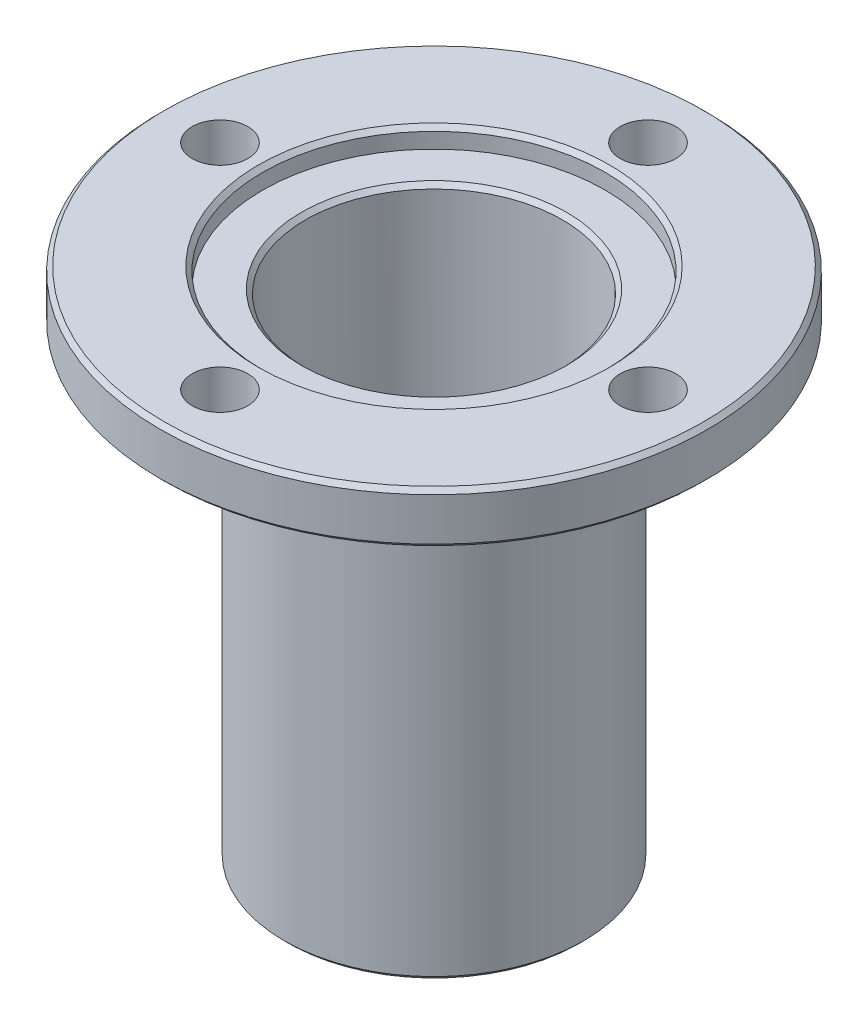
ISO-10303-21;
HEADER;
FILE_DESCRIPTION(('STEP AP214'),'2;1');
FILE_NAME('part.step','',(''),(''),'','','');
FILE_SCHEMA(('AUTOMOTIVE_DESIGN { 1 0 10303 214 1 1 1 1 }'));
ENDSEC;
DATA;
#1=APPLICATION_CONTEXT('core data for automotive mechanical design processes');
#2=APPLICATION_PROTOCOL_DEFINITION('international standard','automotive_design',2000,#1);
#3=PRODUCT_CONTEXT('',#1,'mechanical');
#4=PRODUCT('Part','Part','',(#3));
#5=PRODUCT_RELATED_PRODUCT_CATEGORY('part','',(#4));
#6=PRODUCT_DEFINITION_FORMATION('','',#4);
#7=PRODUCT_DEFINITION_CONTEXT('part definition',#1,'design');
#8=PRODUCT_DEFINITION('design','',#6,#7);
#9=PRODUCT_DEFINITION_SHAPE('','',#8);
#10=(LENGTH_UNIT() NAMED_UNIT(*) SI_UNIT(.MILLI.,.METRE.));
#11=(NAMED_UNIT(*) PLANE_ANGLE_UNIT() SI_UNIT($,.RADIAN.));
#12=(NAMED_UNIT(*) SI_UNIT($,.STERADIAN.) SOLID_ANGLE_UNIT());
#13=UNCERTAINTY_MEASURE_WITH_UNIT(LENGTH_MEASURE(1.E-05),#10,'distance_accuracy_value','');
#14=(GEOMETRIC_REPRESENTATION_CONTEXT(3) GLOBAL_UNCERTAINTY_ASSIGNED_CONTEXT((#13)) GLOBAL_UNIT_ASSIGNED_CONTEXT((#10,
#11,#12)) REPRESENTATION_CONTEXT('',''));
#15=CARTESIAN_POINT('',(0.,0.,0.));
#16=DIRECTION('',(0.,0.,1.));
#17=DIRECTION('',(1.,0.,0.));
#18=AXIS2_PLACEMENT_3D('',#15,#16,#17);
#19=CARTESIAN_POINT('',(0.,6.,0.));
#20=DIRECTION('',(0.,-1.,0.));
#21=DIRECTION('',(0.,0.,-1.));
#22=AXIS2_PLACEMENT_3D('',#19,#20,#21);
#23=CYLINDRICAL_SURFACE('',#22,32.);
#24=CARTESIAN_POINT('',(0.,0.499999999999994,0.));
#25=DIRECTION('',(0.,1.,0.));
#26=DIRECTION('',(0.,0.,1.));
#27=AXIS2_PLACEMENT_3D('',#24,#25,#26);
#28=CIRCLE('',#27,32.);
#29=CARTESIAN_POINT('',(0.,0.499999999999994,32.));
#30=VERTEX_POINT('',#29);
#31=EDGE_CURVE('E41',#30,#30,#28,.T.);
#32=ORIENTED_EDGE('',*,*,#31,.T.);
#33=EDGE_LOOP('',(#32));
#34=FACE_BOUND('',#33,.T.);
#35=CARTESIAN_POINT('',(0.,5.50000000000001,0.));
#36=DIRECTION('',(0.,1.,0.));
#37=DIRECTION('',(0.,0.,1.));
#38=AXIS2_PLACEMENT_3D('',#35,#36,#37);
#39=CIRCLE('',#38,32.);
#40=CARTESIAN_POINT('',(0.,5.50000000000001,32.));
#41=VERTEX_POINT('',#40);
#42=EDGE_CURVE('E45',#41,#41,#39,.F.);
#43=ORIENTED_EDGE('',*,*,#42,.T.);
#44=EDGE_LOOP('',(#43));
#45=FACE_BOUND('',#44,.T.);
#46=ADVANCED_FACE('F33',(#34,#45),#23,.T.);
#47=CARTESIAN_POINT('',(0.,6.,0.));
#48=DIRECTION('',(0.,1.,0.));
#49=DIRECTION('',(0.,0.,1.));
#50=AXIS2_PLACEMENT_3D('',#47,#48,#49);
#51=PLANE('',#50);
#52=CARTESIAN_POINT('',(0.,6.,0.));
#53=DIRECTION('',(0.,1.,0.));
#54=DIRECTION('',(0.,0.,1.));
#55=AXIS2_PLACEMENT_3D('',#52,#53,#54);
#56=CIRCLE('',#55,20.5);
#57=CARTESIAN_POINT('',(0.,6.,20.5));
#58=VERTEX_POINT('',#57);
#59=EDGE_CURVE('E49',#58,#58,#56,.F.);
#60=ORIENTED_EDGE('',*,*,#59,.T.);
#61=EDGE_LOOP('',(#60));
#62=FACE_BOUND('',#61,.T.);
#63=CARTESIAN_POINT('',(0.,6.,0.));
#64=DIRECTION('',(0.,1.,0.));
#65=DIRECTION('',(0.,0.,1.));
#66=AXIS2_PLACEMENT_3D('',#63,#64,#65);
#67=CIRCLE('',#66,31.5);
#68=CARTESIAN_POINT('',(0.,6.,31.5));
#69=VERTEX_POINT('',#68);
#70=EDGE_CURVE('E54',#69,#69,#67,.T.);
#71=ORIENTED_EDGE('',*,*,#70,.T.);
#72=EDGE_LOOP('',(#71));
#73=FACE_BOUND('',#72,.T.);
#74=CARTESIAN_POINT('',(0.,6.,-25.));
#75=DIRECTION('',(0.,1.,0.));
#76=DIRECTION('',(0.,0.,1.));
#77=AXIS2_PLACEMENT_3D('',#74,#75,#76);
#78=CIRCLE('',#77,3.25);
#79=CARTESIAN_POINT('',(0.,6.,-21.75));
#80=VERTEX_POINT('',#79);
#81=EDGE_CURVE('E92',#80,#80,#78,.T.);
#82=ORIENTED_EDGE('',*,*,#81,.F.);
#83=EDGE_LOOP('',(#82));
#84=FACE_BOUND('',#83,.T.);
#85=CARTESIAN_POINT('',(25.,6.,0.));
#86=DIRECTION('',(0.,1.,0.));
#87=DIRECTION('',(0.,0.,1.));
#88=AXIS2_PLACEMENT_3D('',#85,#86,#87);
#89=CIRCLE('',#88,3.25);
#90=CARTESIAN_POINT('',(25.,6.,3.25));
#91=VERTEX_POINT('',#90);
#92=EDGE_CURVE('E103',#91,#91,#89,.T.);
#93=ORIENTED_EDGE('',*,*,#92,.F.);
#94=EDGE_LOOP('',(#93));
#95=FACE_BOUND('',#94,.T.);
#96=CARTESIAN_POINT('',(0.,6.,25.));
#97=DIRECTION('',(0.,1.,0.));
#98=DIRECTION('',(0.,0.,1.));
#99=AXIS2_PLACEMENT_3D('',#96,#97,#98);
#100=CIRCLE('',#99,3.25);
#101=CARTESIAN_POINT('',(0.,6.,28.25));
#102=VERTEX_POINT('',#101);
#103=EDGE_CURVE('E100',#102,#102,#100,.T.);
#104=ORIENTED_EDGE('',*,*,#103,.F.);
#105=EDGE_LOOP('',(#104));
#106=FACE_BOUND('',#105,.T.);
#107=CARTESIAN_POINT('',(-25.,6.,0.));
#108=DIRECTION('',(0.,1.,0.));
#109=DIRECTION('',(0.,0.,1.));
#110=AXIS2_PLACEMENT_3D('',#107,#108,#109);
#111=CIRCLE('',#110,3.25);
#112=CARTESIAN_POINT('',(-25.,6.,3.25));
#113=VERTEX_POINT('',#112);
#114=EDGE_CURVE('E97',#113,#113,#111,.T.);
#115=ORIENTED_EDGE('',*,*,#114,.F.);
#116=EDGE_LOOP('',(#115));
#117=FACE_BOUND('',#116,.T.);
#118=ADVANCED_FACE('F112',(#62,#73,#84,#95,#106,#117),#51,.T.);
#119=CARTESIAN_POINT('',(0.,0.,0.));
#120=DIRECTION('',(0.,1.,0.));
#121=DIRECTION('',(0.,0.,1.));
#122=AXIS2_PLACEMENT_3D('',#119,#120,#121);
#123=PLANE('',#122);
#124=CARTESIAN_POINT('',(0.,0.,0.));
#125=DIRECTION('',(0.,1.,0.));
#126=DIRECTION('',(0.,0.,1.));
#127=AXIS2_PLACEMENT_3D('',#124,#125,#126);
#128=CIRCLE('',#127,31.5);
#129=CARTESIAN_POINT('',(0.,0.,31.5));
#130=VERTEX_POINT('',#129);
#131=EDGE_CURVE('E10',#130,#130,#128,.F.);
#132=ORIENTED_EDGE('',*,*,#131,.T.);
#133=EDGE_LOOP('',(#132));
#134=FACE_BOUND('',#133,.T.);
#135=CARTESIAN_POINT('',(0.,0.,-25.));
#136=DIRECTION('',(0.,1.,0.));
#137=DIRECTION('',(0.,0.,1.));
#138=AXIS2_PLACEMENT_3D('',#135,#136,#137);
#139=CIRCLE('',#138,3.25);
#140=CARTESIAN_POINT('',(0.,0.,-21.75));
#141=VERTEX_POINT('',#140);
#142=EDGE_CURVE('E79',#141,#141,#139,.T.);
#143=ORIENTED_EDGE('',*,*,#142,.T.);
#144=EDGE_LOOP('',(#143));
#145=FACE_BOUND('',#144,.T.);
#146=CARTESIAN_POINT('',(25.,0.,0.));
#147=DIRECTION('',(0.,1.,0.));
#148=DIRECTION('',(0.,0.,1.));
#149=AXIS2_PLACEMENT_3D('',#146,#147,#148);
#150=CIRCLE('',#149,3.25);
#151=CARTESIAN_POINT('',(25.,0.,3.25));
#152=VERTEX_POINT('',#151);
#153=EDGE_CURVE('E83',#152,#152,#150,.T.);
#154=ORIENTED_EDGE('',*,*,#153,.T.);
#155=EDGE_LOOP('',(#154));
#156=FACE_BOUND('',#155,.T.);
#157=CARTESIAN_POINT('',(0.,0.,25.));
#158=DIRECTION('',(0.,1.,0.));
#159=DIRECTION('',(0.,0.,1.));
#160=AXIS2_PLACEMENT_3D('',#157,#158,#159);
#161=CIRCLE('',#160,3.25);
#162=CARTESIAN_POINT('',(0.,0.,28.25));
#163=VERTEX_POINT('',#162);
#164=EDGE_CURVE('E86',#163,#163,#161,.T.);
#165=ORIENTED_EDGE('',*,*,#164,.T.);
#166=EDGE_LOOP('',(#165));
#167=FACE_BOUND('',#166,.T.);
#168=CARTESIAN_POINT('',(-25.,0.,0.));
#169=DIRECTION('',(0.,1.,0.));
#170=DIRECTION('',(0.,0.,1.));
#171=AXIS2_PLACEMENT_3D('',#168,#169,#170);
#172=CIRCLE('',#171,3.25);
#173=CARTESIAN_POINT('',(-25.,0.,3.25));
#174=VERTEX_POINT('',#173);
#175=EDGE_CURVE('E89',#174,#174,#172,.T.);
#176=ORIENTED_EDGE('',*,*,#175,.T.);
#177=EDGE_LOOP('',(#176));
#178=FACE_BOUND('',#177,.T.);
#179=CARTESIAN_POINT('',(0.,0.,0.));
#180=DIRECTION('',(0.,-1.,0.));
#181=DIRECTION('',(0.,0.,-1.));
#182=AXIS2_PLACEMENT_3D('',#179,#180,#181);
#183=CIRCLE('',#182,17.5);
#184=CARTESIAN_POINT('',(0.,0.,-17.5));
#185=VERTEX_POINT('',#184);
#186=EDGE_CURVE('E78',#185,#185,#183,.T.);
#187=ORIENTED_EDGE('',*,*,#186,.F.);
#188=EDGE_LOOP('',(#187));
#189=FACE_BOUND('',#188,.T.);
#190=ADVANCED_FACE('F115',(#134,#145,#156,#167,#178,#189),#123,.F.);
#191=CARTESIAN_POINT('',(0.,-54.,0.));
#192=DIRECTION('',(0.,1.,0.));
#193=DIRECTION('',(0.,0.,1.));
#194=AXIS2_PLACEMENT_3D('',#191,#192,#193);
#195=CYLINDRICAL_SURFACE('',#194,17.5);
#196=CARTESIAN_POINT('',(0.,-53.5,0.));
#197=DIRECTION('',(0.,-1.,0.));
#198=DIRECTION('',(0.,0.,-1.));
#199=AXIS2_PLACEMENT_3D('',#196,#197,#198);
#200=CIRCLE('',#199,17.5);
#201=CARTESIAN_POINT('',(0.,-53.5,-17.5));
#202=VERTEX_POINT('',#201);
#203=EDGE_CURVE('E69',#202,#202,#200,.F.);
#204=ORIENTED_EDGE('',*,*,#203,.T.);
#205=EDGE_LOOP('',(#204));
#206=FACE_BOUND('',#205,.T.);
#207=ORIENTED_EDGE('',*,*,#186,.T.);
#208=EDGE_LOOP('',(#207));
#209=FACE_BOUND('',#208,.T.);
#210=ADVANCED_FACE('F134',(#206,#209),#195,.T.);
#211=CARTESIAN_POINT('',(0.,-54.,0.));
#212=DIRECTION('',(0.,-1.,0.));
#213=DIRECTION('',(0.,0.,-1.));
#214=AXIS2_PLACEMENT_3D('',#211,#212,#213);
#215=PLANE('',#214);
#216=CARTESIAN_POINT('',(0.,-54.,0.));
#217=DIRECTION('',(0.,-1.,0.));
#218=DIRECTION('',(0.,0.,-1.));
#219=AXIS2_PLACEMENT_3D('',#216,#217,#218);
#220=CIRCLE('',#219,17.);
#221=CARTESIAN_POINT('',(0.,-54.,-17.));
#222=VERTEX_POINT('',#221);
#223=EDGE_CURVE('E72',#222,#222,#220,.T.);
#224=ORIENTED_EDGE('',*,*,#223,.T.);
#225=EDGE_LOOP('',(#224));
#226=FACE_BOUND('',#225,.T.);
#227=CARTESIAN_POINT('',(0.,-54.,0.));
#228=DIRECTION('',(0.,-1.,0.));
#229=DIRECTION('',(0.,0.,-1.));
#230=AXIS2_PLACEMENT_3D('',#227,#228,#229);
#231=CIRCLE('',#230,15.5);
#232=CARTESIAN_POINT('',(0.,-54.,-15.5));
#233=VERTEX_POINT('',#232);
#234=EDGE_CURVE('E75',#233,#233,#231,.F.);
#235=ORIENTED_EDGE('',*,*,#234,.T.);
#236=EDGE_LOOP('',(#235));
#237=FACE_BOUND('',#236,.T.);
#238=ADVANCED_FACE('F139',(#226,#237),#215,.T.);
#239=CARTESIAN_POINT('',(0.,3.7,0.));
#240=DIRECTION('',(0.,1.,0.));
#241=DIRECTION('',(0.,0.,1.));
#242=AXIS2_PLACEMENT_3D('',#239,#240,#241);
#243=CYLINDRICAL_SURFACE('',#242,20.);
#244=CARTESIAN_POINT('',(0.,5.5,0.));
#245=DIRECTION('',(0.,1.,0.));
#246=DIRECTION('',(0.,0.,1.));
#247=AXIS2_PLACEMENT_3D('',#244,#245,#246);
#248=CIRCLE('',#247,20.);
#249=CARTESIAN_POINT('',(0.,5.5,20.));
#250=VERTEX_POINT('',#249);
#251=EDGE_CURVE('E57',#250,#250,#248,.T.);
#252=ORIENTED_EDGE('',*,*,#251,.T.);
#253=EDGE_LOOP('',(#252));
#254=FACE_BOUND('',#253,.T.);
#255=CARTESIAN_POINT('',(0.,3.7,0.));
#256=DIRECTION('',(0.,1.,0.));
#257=DIRECTION('',(0.,0.,1.));
#258=AXIS2_PLACEMENT_3D('',#255,#256,#257);
#259=CIRCLE('',#258,20.);
#260=CARTESIAN_POINT('',(0.,3.7,20.));
#261=VERTEX_POINT('',#260);
#262=EDGE_CURVE('E82',#261,#261,#259,.T.);
#263=ORIENTED_EDGE('',*,*,#262,.F.);
#264=EDGE_LOOP('',(#263));
#265=FACE_BOUND('',#264,.T.);
#266=ADVANCED_FACE('F145',(#254,#265),#243,.F.);
#267=CARTESIAN_POINT('',(0.,3.7,0.));
#268=DIRECTION('',(0.,1.,0.));
#269=DIRECTION('',(0.,0.,1.));
#270=AXIS2_PLACEMENT_3D('',#267,#268,#269);
#271=PLANE('',#270);
#272=CARTESIAN_POINT('',(0.,3.7,0.));
#273=DIRECTION('',(0.,1.,0.));
#274=DIRECTION('',(0.,0.,1.));
#275=AXIS2_PLACEMENT_3D('',#272,#273,#274);
#276=CIRCLE('',#275,15.5);
#277=CARTESIAN_POINT('',(0.,3.7,15.5));
#278=VERTEX_POINT('',#277);
#279=EDGE_CURVE('E60',#278,#278,#276,.F.);
#280=ORIENTED_EDGE('',*,*,#279,.T.);
#281=EDGE_LOOP('',(#280));
#282=FACE_BOUND('',#281,.T.);
#283=ORIENTED_EDGE('',*,*,#262,.T.);
#284=EDGE_LOOP('',(#283));
#285=FACE_BOUND('',#284,.T.);
#286=ADVANCED_FACE('F237',(#282,#285),#271,.T.);
#287=CARTESIAN_POINT('',(0.,-54.,0.));
#288=DIRECTION('',(0.,1.,0.));
#289=DIRECTION('',(0.,0.,1.));
#290=AXIS2_PLACEMENT_3D('',#287,#288,#289);
#291=CYLINDRICAL_SURFACE('',#290,15.);
#292=CARTESIAN_POINT('',(0.,-53.5,0.));
#293=DIRECTION('',(0.,-1.,0.));
#294=DIRECTION('',(0.,0.,-1.));
#295=AXIS2_PLACEMENT_3D('',#292,#293,#294);
#296=CIRCLE('',#295,15.);
#297=CARTESIAN_POINT('',(0.,-53.5,-15.));
#298=VERTEX_POINT('',#297);
#299=EDGE_CURVE('E63',#298,#298,#296,.T.);
#300=ORIENTED_EDGE('',*,*,#299,.T.);
#301=EDGE_LOOP('',(#300));
#302=FACE_BOUND('',#301,.T.);
#303=CARTESIAN_POINT('',(0.,3.20000000000002,0.));
#304=DIRECTION('',(0.,1.,0.));
#305=DIRECTION('',(0.,0.,1.));
#306=AXIS2_PLACEMENT_3D('',#303,#304,#305);
#307=CIRCLE('',#306,15.);
#308=CARTESIAN_POINT('',(0.,3.20000000000002,15.));
#309=VERTEX_POINT('',#308);
#310=EDGE_CURVE('E66',#309,#309,#307,.T.);
#311=ORIENTED_EDGE('',*,*,#310,.T.);
#312=EDGE_LOOP('',(#311));
#313=FACE_BOUND('',#312,.T.);
#314=ADVANCED_FACE('F128',(#302,#313),#291,.F.);
#315=CARTESIAN_POINT('',(-25.,-54.,0.));
#316=DIRECTION('',(0.,1.,0.));
#317=DIRECTION('',(0.,0.,1.));
#318=AXIS2_PLACEMENT_3D('',#315,#316,#317);
#319=CYLINDRICAL_SURFACE('',#318,3.25);
#320=ORIENTED_EDGE('',*,*,#114,.T.);
#321=EDGE_LOOP('',(#320));
#322=FACE_BOUND('',#321,.T.);
#323=ORIENTED_EDGE('',*,*,#175,.F.);
#324=EDGE_LOOP('',(#323));
#325=FACE_BOUND('',#324,.T.);
#326=ADVANCED_FACE('F124',(#322,#325),#319,.F.);
#327=CARTESIAN_POINT('',(0.,-54.,25.));
#328=DIRECTION('',(0.,1.,0.));
#329=DIRECTION('',(0.,0.,1.));
#330=AXIS2_PLACEMENT_3D('',#327,#328,#329);
#331=CYLINDRICAL_SURFACE('',#330,3.25);
#332=ORIENTED_EDGE('',*,*,#103,.T.);
#333=EDGE_LOOP('',(#332));
#334=FACE_BOUND('',#333,.T.);
#335=ORIENTED_EDGE('',*,*,#164,.F.);
#336=EDGE_LOOP('',(#335));
#337=FACE_BOUND('',#336,.T.);
#338=ADVANCED_FACE('F127',(#334,#337),#331,.F.);
#339=CARTESIAN_POINT('',(25.,-54.,0.));
#340=DIRECTION('',(0.,1.,0.));
#341=DIRECTION('',(0.,0.,1.));
#342=AXIS2_PLACEMENT_3D('',#339,#340,#341);
#343=CYLINDRICAL_SURFACE('',#342,3.25);
#344=ORIENTED_EDGE('',*,*,#92,.T.);
#345=EDGE_LOOP('',(#344));
#346=FACE_BOUND('',#345,.T.);
#347=ORIENTED_EDGE('',*,*,#153,.F.);
#348=EDGE_LOOP('',(#347));
#349=FACE_BOUND('',#348,.T.);
#350=ADVANCED_FACE('F290',(#346,#349),#343,.F.);
#351=CARTESIAN_POINT('',(0.,-54.,-25.));
#352=DIRECTION('',(0.,1.,0.));
#353=DIRECTION('',(0.,0.,1.));
#354=AXIS2_PLACEMENT_3D('',#351,#352,#353);
#355=CYLINDRICAL_SURFACE('',#354,3.25);
#356=ORIENTED_EDGE('',*,*,#81,.T.);
#357=EDGE_LOOP('',(#356));
#358=FACE_BOUND('',#357,.T.);
#359=ORIENTED_EDGE('',*,*,#142,.F.);
#360=EDGE_LOOP('',(#359));
#361=FACE_BOUND('',#360,.T.);
#362=ADVANCED_FACE('F109',(#358,#361),#355,.F.);
#363=CARTESIAN_POINT('',(0.,-54.,0.));
#364=DIRECTION('',(0.,1.,0.));
#365=DIRECTION('',(0.,0.,1.));
#366=AXIS2_PLACEMENT_3D('',#363,#364,#365);
#367=CONICAL_SURFACE('',#366,17.,0.785398163397445);
#368=ORIENTED_EDGE('',*,*,#203,.F.);
#369=EDGE_LOOP('',(#368));
#370=FACE_BOUND('',#369,.T.);
#371=ORIENTED_EDGE('',*,*,#223,.F.);
#372=EDGE_LOOP('',(#371));
#373=FACE_BOUND('',#372,.T.);
#374=ADVANCED_FACE('F155',(#370,#373),#367,.T.);
#375=CARTESIAN_POINT('',(0.,-54.,0.));
#376=DIRECTION('',(0.,-1.,0.));
#377=DIRECTION('',(0.,0.,-1.));
#378=AXIS2_PLACEMENT_3D('',#375,#376,#377);
#379=CONICAL_SURFACE('',#378,15.5,0.785398163397453);
#380=ORIENTED_EDGE('',*,*,#299,.F.);
#381=EDGE_LOOP('',(#380));
#382=FACE_BOUND('',#381,.T.);
#383=ORIENTED_EDGE('',*,*,#234,.F.);
#384=EDGE_LOOP('',(#383));
#385=FACE_BOUND('',#384,.T.);
#386=ADVANCED_FACE('F161',(#382,#385),#379,.F.);
#387=CARTESIAN_POINT('',(0.,3.20000000000002,0.));
#388=DIRECTION('',(0.,1.,0.));
#389=DIRECTION('',(0.,0.,1.));
#390=AXIS2_PLACEMENT_3D('',#387,#388,#389);
#391=CONICAL_SURFACE('',#390,15.,0.78539816339745);
#392=ORIENTED_EDGE('',*,*,#279,.F.);
#393=EDGE_LOOP('',(#392));
#394=FACE_BOUND('',#393,.T.);
#395=ORIENTED_EDGE('',*,*,#310,.F.);
#396=EDGE_LOOP('',(#395));
#397=FACE_BOUND('',#396,.T.);
#398=ADVANCED_FACE('F168',(#394,#397),#391,.F.);
#399=CARTESIAN_POINT('',(0.,5.5,0.));
#400=DIRECTION('',(0.,1.,0.));
#401=DIRECTION('',(0.,0.,1.));
#402=AXIS2_PLACEMENT_3D('',#399,#400,#401);
#403=CONICAL_SURFACE('',#402,20.,0.785398163397448);
#404=ORIENTED_EDGE('',*,*,#59,.F.);
#405=EDGE_LOOP('',(#404));
#406=FACE_BOUND('',#405,.T.);
#407=ORIENTED_EDGE('',*,*,#251,.F.);
#408=EDGE_LOOP('',(#407));
#409=FACE_BOUND('',#408,.T.);
#410=ADVANCED_FACE('F175',(#406,#409),#403,.F.);
#411=CARTESIAN_POINT('',(0.,0.499999999999994,0.));
#412=DIRECTION('',(0.,1.,0.));
#413=DIRECTION('',(0.,0.,1.));
#414=AXIS2_PLACEMENT_3D('',#411,#412,#413);
#415=CONICAL_SURFACE('',#414,32.,0.785398163397448);
#416=ORIENTED_EDGE('',*,*,#131,.F.);
#417=EDGE_LOOP('',(#416));
#418=FACE_BOUND('',#417,.T.);
#419=ORIENTED_EDGE('',*,*,#31,.F.);
#420=EDGE_LOOP('',(#419));
#421=FACE_BOUND('',#420,.T.);
#422=ADVANCED_FACE('F181',(#418,#421),#415,.T.);
#423=CARTESIAN_POINT('',(0.,6.,0.));
#424=DIRECTION('',(0.,-1.,0.));
#425=DIRECTION('',(0.,0.,-1.));
#426=AXIS2_PLACEMENT_3D('',#423,#424,#425);
#427=CONICAL_SURFACE('',#426,31.5,0.785398163397448);
#428=ORIENTED_EDGE('',*,*,#42,.F.);
#429=EDGE_LOOP('',(#428));
#430=FACE_BOUND('',#429,.T.);
#431=ORIENTED_EDGE('',*,*,#70,.F.);
#432=EDGE_LOOP('',(#431));
#433=FACE_BOUND('',#432,.T.);
#434=ADVANCED_FACE('F36',(#430,#433),#427,.T.);
#435=CLOSED_SHELL('',(#46,#118,#190,#210,#238,#266,#286,#314,#326,#338,#350,#362,#374,#386,#398,
#410,#422,#434));
#436=MANIFOLD_SOLID_BREP('B2',#435);
#437=ADVANCED_BREP_SHAPE_REPRESENTATION('',(#18,#436),#14);
#438=SHAPE_DEFINITION_REPRESENTATION(#9,#437);
ENDSEC;
END-ISO-10303-21;
